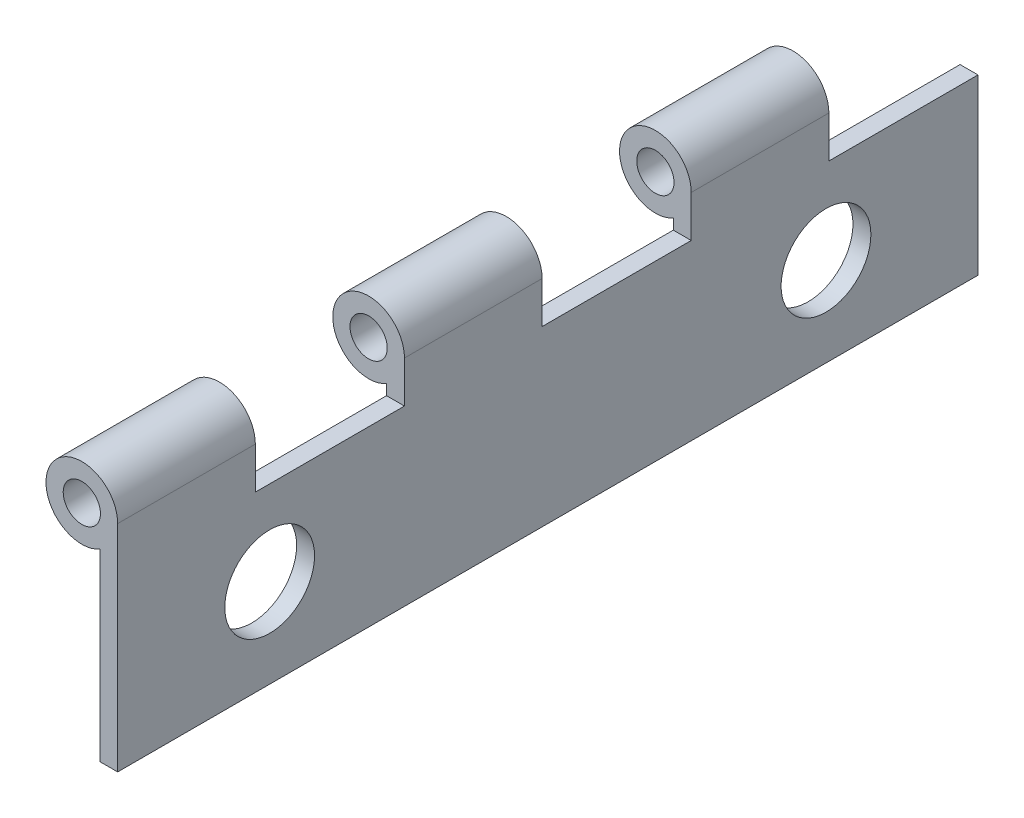
ISO-10303-21;
HEADER;
FILE_DESCRIPTION(('STEP AP214'),'2;1');
FILE_NAME('part.step','',(''),(''),'','','');
FILE_SCHEMA(('AUTOMOTIVE_DESIGN { 1 0 10303 214 1 1 1 1 }'));
ENDSEC;
DATA;
#1=APPLICATION_CONTEXT('core data for automotive mechanical design processes');
#2=APPLICATION_PROTOCOL_DEFINITION('international standard','automotive_design',2000,#1);
#3=PRODUCT_CONTEXT('',#1,'mechanical');
#4=PRODUCT('Part','Part','',(#3));
#5=PRODUCT_RELATED_PRODUCT_CATEGORY('part','',(#4));
#6=PRODUCT_DEFINITION_FORMATION('','',#4);
#7=PRODUCT_DEFINITION_CONTEXT('part definition',#1,'design');
#8=PRODUCT_DEFINITION('design','',#6,#7);
#9=PRODUCT_DEFINITION_SHAPE('','',#8);
#10=(LENGTH_UNIT() NAMED_UNIT(*) SI_UNIT(.MILLI.,.METRE.));
#11=(NAMED_UNIT(*) PLANE_ANGLE_UNIT() SI_UNIT($,.RADIAN.));
#12=(NAMED_UNIT(*) SI_UNIT($,.STERADIAN.) SOLID_ANGLE_UNIT());
#13=UNCERTAINTY_MEASURE_WITH_UNIT(LENGTH_MEASURE(1.E-05),#10,'distance_accuracy_value','');
#14=(GEOMETRIC_REPRESENTATION_CONTEXT(3) GLOBAL_UNCERTAINTY_ASSIGNED_CONTEXT((#13)) GLOBAL_UNIT_ASSIGNED_CONTEXT((#10,
#11,#12)) REPRESENTATION_CONTEXT('',''));
#15=CARTESIAN_POINT('',(0.,0.,0.));
#16=DIRECTION('',(0.,0.,1.));
#17=DIRECTION('',(1.,0.,0.));
#18=AXIS2_PLACEMENT_3D('',#15,#16,#17);
#19=CARTESIAN_POINT('',(-1.58750000000001,19.05,76.2));
#20=DIRECTION('',(0.,0.,-1.));
#21=DIRECTION('',(-1.,0.,0.));
#22=AXIS2_PLACEMENT_3D('',#19,#20,#21);
#23=CYLINDRICAL_SURFACE('',#22,1.651);
#24=CARTESIAN_POINT('',(-1.58750000000001,19.05,25.4));
#25=DIRECTION('',(0.,0.,-1.));
#26=DIRECTION('',(-1.,0.,0.));
#27=AXIS2_PLACEMENT_3D('',#24,#25,#26);
#28=CIRCLE('',#27,1.651);
#29=CARTESIAN_POINT('',(-3.23850000000001,19.05,25.4));
#30=VERTEX_POINT('',#29);
#31=EDGE_CURVE('E204',#30,#30,#28,.F.);
#32=ORIENTED_EDGE('',*,*,#31,.T.);
#33=EDGE_LOOP('',(#32));
#34=FACE_BOUND('',#33,.T.);
#35=CARTESIAN_POINT('',(-1.58750000000001,19.05,13.208));
#36=DIRECTION('',(0.,0.,-1.));
#37=DIRECTION('',(-1.,0.,0.));
#38=AXIS2_PLACEMENT_3D('',#35,#36,#37);
#39=CIRCLE('',#38,1.651);
#40=CARTESIAN_POINT('',(-3.23850000000001,19.05,13.208));
#41=VERTEX_POINT('',#40);
#42=EDGE_CURVE('E20',#41,#41,#39,.T.);
#43=ORIENTED_EDGE('',*,*,#42,.T.);
#44=EDGE_LOOP('',(#43));
#45=FACE_BOUND('',#44,.T.);
#46=ADVANCED_FACE('F17',(#34,#45),#23,.F.);
#47=CARTESIAN_POINT('',(-1.58750000000001,19.05,76.2));
#48=DIRECTION('',(0.,0.,-1.));
#49=DIRECTION('',(-1.,0.,0.));
#50=AXIS2_PLACEMENT_3D('',#47,#48,#49);
#51=CYLINDRICAL_SURFACE('',#50,1.651);
#52=CARTESIAN_POINT('',(-1.58750000000001,19.05,38.608));
#53=DIRECTION('',(0.,0.,-1.));
#54=DIRECTION('',(-1.,0.,0.));
#55=AXIS2_PLACEMENT_3D('',#52,#53,#54);
#56=CIRCLE('',#55,1.651);
#57=CARTESIAN_POINT('',(-3.23850000000001,19.05,38.608));
#58=VERTEX_POINT('',#57);
#59=EDGE_CURVE('E231',#58,#58,#56,.T.);
#60=ORIENTED_EDGE('',*,*,#59,.T.);
#61=EDGE_LOOP('',(#60));
#62=FACE_BOUND('',#61,.T.);
#63=CARTESIAN_POINT('',(-1.58750000000001,19.05,50.8));
#64=DIRECTION('',(0.,0.,-1.));
#65=DIRECTION('',(-1.,0.,0.));
#66=AXIS2_PLACEMENT_3D('',#63,#64,#65);
#67=CIRCLE('',#66,1.651);
#68=CARTESIAN_POINT('',(-3.23850000000001,19.05,50.8));
#69=VERTEX_POINT('',#68);
#70=EDGE_CURVE('E192',#69,#69,#67,.F.);
#71=ORIENTED_EDGE('',*,*,#70,.T.);
#72=EDGE_LOOP('',(#71));
#73=FACE_BOUND('',#72,.T.);
#74=ADVANCED_FACE('F369',(#62,#73),#51,.F.);
#75=CARTESIAN_POINT('',(-1.58750000000001,19.05,76.2));
#76=DIRECTION('',(0.,0.,-1.));
#77=DIRECTION('',(-1.,0.,0.));
#78=AXIS2_PLACEMENT_3D('',#75,#76,#77);
#79=CYLINDRICAL_SURFACE('',#78,1.651);
#80=CARTESIAN_POINT('',(-1.58750000000001,19.05,64.008));
#81=DIRECTION('',(0.,0.,-1.));
#82=DIRECTION('',(-1.,0.,0.));
#83=AXIS2_PLACEMENT_3D('',#80,#81,#82);
#84=CIRCLE('',#83,1.651);
#85=CARTESIAN_POINT('',(-3.23850000000001,19.05,64.008));
#86=VERTEX_POINT('',#85);
#87=EDGE_CURVE('E221',#86,#86,#84,.T.);
#88=ORIENTED_EDGE('',*,*,#87,.T.);
#89=EDGE_LOOP('',(#88));
#90=FACE_BOUND('',#89,.T.);
#91=CARTESIAN_POINT('',(-1.58750000000001,19.05,76.2));
#92=DIRECTION('',(0.,0.,-1.));
#93=DIRECTION('',(-1.,0.,0.));
#94=AXIS2_PLACEMENT_3D('',#91,#92,#93);
#95=CIRCLE('',#94,1.651);
#96=CARTESIAN_POINT('',(-3.23850000000001,19.05,76.2));
#97=VERTEX_POINT('',#96);
#98=EDGE_CURVE('E213',#97,#97,#95,.T.);
#99=ORIENTED_EDGE('',*,*,#98,.F.);
#100=EDGE_LOOP('',(#99));
#101=FACE_BOUND('',#100,.T.);
#102=ADVANCED_FACE('F360',(#90,#101),#79,.F.);
#103=CARTESIAN_POINT('',(0.,0.,0.));
#104=DIRECTION('',(-1.,0.,0.));
#105=DIRECTION('',(0.,-1.,0.));
#106=AXIS2_PLACEMENT_3D('',#103,#104,#105);
#107=PLANE('',#106);
#108=CARTESIAN_POINT('',(0.,7.874,13.462));
#109=DIRECTION('',(1.,0.,0.));
#110=DIRECTION('',(0.,0.,-1.));
#111=AXIS2_PLACEMENT_3D('',#108,#109,#110);
#112=CIRCLE('',#111,3.9751);
#113=CARTESIAN_POINT('',(0.,7.874,9.4869));
#114=VERTEX_POINT('',#113);
#115=EDGE_CURVE('E142',#114,#114,#112,.T.);
#116=ORIENTED_EDGE('',*,*,#115,.T.);
#117=EDGE_LOOP('',(#116));
#118=FACE_BOUND('',#117,.T.);
#119=CARTESIAN_POINT('',(0.,7.874,62.738));
#120=DIRECTION('',(1.,0.,0.));
#121=DIRECTION('',(0.,0.,-1.));
#122=AXIS2_PLACEMENT_3D('',#119,#120,#121);
#123=CIRCLE('',#122,3.9751);
#124=CARTESIAN_POINT('',(0.,7.874,58.7629));
#125=VERTEX_POINT('',#124);
#126=EDGE_CURVE('E145',#125,#125,#123,.T.);
#127=ORIENTED_EDGE('',*,*,#126,.T.);
#128=EDGE_LOOP('',(#127));
#129=FACE_BOUND('',#128,.T.);
#130=DIRECTION('',(0.,0.,1.));
#131=VECTOR('',#130,1.);
#132=CARTESIAN_POINT('',(0.,16.3003693429844,0.));
#133=LINE('',#132,#131);
#134=CARTESIAN_POINT('',(0.,16.3003693429844,13.208));
#135=VERTEX_POINT('',#134);
#136=CARTESIAN_POINT('',(0.,16.3003693429844,25.4));
#137=VERTEX_POINT('',#136);
#138=EDGE_CURVE('E127',#135,#137,#133,.T.);
#139=ORIENTED_EDGE('',*,*,#138,.F.);
#140=DIRECTION('',(0.,1.,0.));
#141=VECTOR('',#140,1.);
#142=CARTESIAN_POINT('',(0.,22.225,13.208));
#143=LINE('',#142,#141);
#144=CARTESIAN_POINT('',(0.,15.367,13.208));
#145=VERTEX_POINT('',#144);
#146=EDGE_CURVE('E123',#135,#145,#143,.F.);
#147=ORIENTED_EDGE('',*,*,#146,.T.);
#148=DIRECTION('',(0.,0.,1.));
#149=VECTOR('',#148,1.);
#150=CARTESIAN_POINT('',(0.,15.367,6.604));
#151=LINE('',#150,#149);
#152=CARTESIAN_POINT('',(0.,15.367,0.));
#153=VERTEX_POINT('',#152);
#154=EDGE_CURVE('E156',#153,#145,#151,.T.);
#155=ORIENTED_EDGE('',*,*,#154,.F.);
#156=DIRECTION('',(0.,1.,0.));
#157=VECTOR('',#156,1.);
#158=CARTESIAN_POINT('',(0.,11.825400192215,0.));
#159=LINE('',#158,#157);
#160=CARTESIAN_POINT('',(0.,0.,0.));
#161=VERTEX_POINT('',#160);
#162=EDGE_CURVE('E168',#153,#161,#159,.F.);
#163=ORIENTED_EDGE('',*,*,#162,.T.);
#164=DIRECTION('',(0.,0.,1.));
#165=VECTOR('',#164,1.);
#166=CARTESIAN_POINT('',(0.,0.,0.));
#167=LINE('',#166,#165);
#168=CARTESIAN_POINT('',(0.,0.,76.2));
#169=VERTEX_POINT('',#168);
#170=EDGE_CURVE('E170',#169,#161,#167,.F.);
#171=ORIENTED_EDGE('',*,*,#170,.F.);
#172=DIRECTION('',(0.,1.,0.));
#173=VECTOR('',#172,1.);
#174=CARTESIAN_POINT('',(0.,11.825400192215,76.2));
#175=LINE('',#174,#173);
#176=CARTESIAN_POINT('',(0.,16.3003693429844,76.2));
#177=VERTEX_POINT('',#176);
#178=EDGE_CURVE('E216',#177,#169,#175,.F.);
#179=ORIENTED_EDGE('',*,*,#178,.F.);
#180=DIRECTION('',(0.,0.,1.));
#181=VECTOR('',#180,1.);
#182=CARTESIAN_POINT('',(0.,16.3003693429844,0.));
#183=LINE('',#182,#181);
#184=CARTESIAN_POINT('',(0.,16.3003693429844,64.008));
#185=VERTEX_POINT('',#184);
#186=EDGE_CURVE('E184',#185,#177,#183,.T.);
#187=ORIENTED_EDGE('',*,*,#186,.F.);
#188=DIRECTION('',(0.,1.,0.));
#189=VECTOR('',#188,1.);
#190=CARTESIAN_POINT('',(0.,22.225,64.008));
#191=LINE('',#190,#189);
#192=CARTESIAN_POINT('',(0.,15.367,64.008));
#193=VERTEX_POINT('',#192);
#194=EDGE_CURVE('E282',#185,#193,#191,.F.);
#195=ORIENTED_EDGE('',*,*,#194,.T.);
#196=DIRECTION('',(0.,0.,1.));
#197=VECTOR('',#196,1.);
#198=CARTESIAN_POINT('',(0.,15.367,57.404));
#199=LINE('',#198,#197);
#200=CARTESIAN_POINT('',(0.,15.367,50.8));
#201=VERTEX_POINT('',#200);
#202=EDGE_CURVE('E188',#201,#193,#199,.T.);
#203=ORIENTED_EDGE('',*,*,#202,.F.);
#204=DIRECTION('',(0.,1.,0.));
#205=VECTOR('',#204,1.);
#206=CARTESIAN_POINT('',(0.,22.225,50.8));
#207=LINE('',#206,#205);
#208=CARTESIAN_POINT('',(0.,16.3003693429844,50.8));
#209=VERTEX_POINT('',#208);
#210=EDGE_CURVE('E198',#201,#209,#207,.T.);
#211=ORIENTED_EDGE('',*,*,#210,.T.);
#212=DIRECTION('',(0.,0.,1.));
#213=VECTOR('',#212,1.);
#214=CARTESIAN_POINT('',(0.,16.3003693429844,0.));
#215=LINE('',#214,#213);
#216=CARTESIAN_POINT('',(0.,16.3003693429844,38.608));
#217=VERTEX_POINT('',#216);
#218=EDGE_CURVE('E195',#217,#209,#215,.T.);
#219=ORIENTED_EDGE('',*,*,#218,.F.);
#220=DIRECTION('',(0.,1.,0.));
#221=VECTOR('',#220,1.);
#222=CARTESIAN_POINT('',(0.,22.225,38.608));
#223=LINE('',#222,#221);
#224=CARTESIAN_POINT('',(0.,15.367,38.608));
#225=VERTEX_POINT('',#224);
#226=EDGE_CURVE('E250',#217,#225,#223,.F.);
#227=ORIENTED_EDGE('',*,*,#226,.T.);
#228=DIRECTION('',(0.,0.,1.));
#229=VECTOR('',#228,1.);
#230=CARTESIAN_POINT('',(0.,15.367,32.004));
#231=LINE('',#230,#229);
#232=CARTESIAN_POINT('',(0.,15.367,25.4));
#233=VERTEX_POINT('',#232);
#234=EDGE_CURVE('E200',#233,#225,#231,.T.);
#235=ORIENTED_EDGE('',*,*,#234,.F.);
#236=DIRECTION('',(0.,1.,0.));
#237=VECTOR('',#236,1.);
#238=CARTESIAN_POINT('',(0.,22.225,25.4));
#239=LINE('',#238,#237);
#240=EDGE_CURVE('E207',#233,#137,#239,.T.);
#241=ORIENTED_EDGE('',*,*,#240,.T.);
#242=EDGE_LOOP('',(#139,#147,#155,#163,#171,#179,#187,#195,#203,#211,#219,#227,#235,#241));
#243=FACE_BOUND('',#242,.T.);
#244=ADVANCED_FACE('F325',(#118,#129,#243),#107,.T.);
#245=CARTESIAN_POINT('',(-4.7625,22.225,13.208));
#246=DIRECTION('',(0.,0.,1.));
#247=DIRECTION('',(1.,0.,0.));
#248=AXIS2_PLACEMENT_3D('',#245,#246,#247);
#249=PLANE('',#248);
#250=ORIENTED_EDGE('',*,*,#42,.F.);
#251=EDGE_LOOP('',(#250));
#252=FACE_BOUND('',#251,.T.);
#253=DIRECTION('',(0.,1.,0.));
#254=VECTOR('',#253,1.);
#255=CARTESIAN_POINT('',(1.58749999999999,19.05,13.208));
#256=LINE('',#255,#254);
#257=CARTESIAN_POINT('',(1.5875,15.367,13.208));
#258=VERTEX_POINT('',#257);
#259=CARTESIAN_POINT('',(1.58749999999999,19.05,13.208));
#260=VERTEX_POINT('',#259);
#261=EDGE_CURVE('E121',#258,#260,#256,.T.);
#262=ORIENTED_EDGE('',*,*,#261,.F.);
#263=DIRECTION('',(1.,0.,0.));
#264=VECTOR('',#263,1.);
#265=CARTESIAN_POINT('',(-1.58750000000001,15.367,13.208));
#266=LINE('',#265,#264);
#267=EDGE_CURVE('E154',#145,#258,#266,.T.);
#268=ORIENTED_EDGE('',*,*,#267,.F.);
#269=ORIENTED_EDGE('',*,*,#146,.F.);
#270=CARTESIAN_POINT('',(-1.58750000000001,19.05,13.208));
#271=DIRECTION('',(0.,0.,1.));
#272=DIRECTION('',(1.,0.,0.));
#273=AXIS2_PLACEMENT_3D('',#270,#271,#272);
#274=CIRCLE('',#273,3.175);
#275=EDGE_CURVE('E116',#260,#135,#274,.T.);
#276=ORIENTED_EDGE('',*,*,#275,.F.);
#277=EDGE_LOOP('',(#262,#268,#269,#276));
#278=FACE_BOUND('',#277,.T.);
#279=ADVANCED_FACE('F118',(#252,#278),#249,.F.);
#280=CARTESIAN_POINT('',(-1.58750000000001,19.05,0.));
#281=DIRECTION('',(0.,0.,1.));
#282=DIRECTION('',(1.,0.,0.));
#283=AXIS2_PLACEMENT_3D('',#280,#281,#282);
#284=CYLINDRICAL_SURFACE('',#283,3.175);
#285=CARTESIAN_POINT('',(-1.58750000000001,19.05,25.4));
#286=DIRECTION('',(0.,0.,1.));
#287=DIRECTION('',(1.,0.,0.));
#288=AXIS2_PLACEMENT_3D('',#285,#286,#287);
#289=CIRCLE('',#288,3.175);
#290=CARTESIAN_POINT('',(1.58749999999999,19.05,25.4));
#291=VERTEX_POINT('',#290);
#292=EDGE_CURVE('E132',#137,#291,#289,.F.);
#293=ORIENTED_EDGE('',*,*,#292,.T.);
#294=DIRECTION('',(0.,0.,1.));
#295=VECTOR('',#294,1.);
#296=CARTESIAN_POINT('',(1.58749999999999,19.05,0.));
#297=LINE('',#296,#295);
#298=EDGE_CURVE('E129',#260,#291,#297,.T.);
#299=ORIENTED_EDGE('',*,*,#298,.F.);
#300=ORIENTED_EDGE('',*,*,#275,.T.);
#301=ORIENTED_EDGE('',*,*,#138,.T.);
#302=EDGE_LOOP('',(#293,#299,#300,#301));
#303=FACE_BOUND('',#302,.T.);
#304=ADVANCED_FACE('F130',(#303),#284,.T.);
#305=CARTESIAN_POINT('',(1.5875,22.225,25.4));
#306=DIRECTION('',(0.,0.,-1.));
#307=DIRECTION('',(-1.,0.,0.));
#308=AXIS2_PLACEMENT_3D('',#305,#306,#307);
#309=PLANE('',#308);
#310=ORIENTED_EDGE('',*,*,#31,.F.);
#311=EDGE_LOOP('',(#310));
#312=FACE_BOUND('',#311,.T.);
#313=ORIENTED_EDGE('',*,*,#240,.F.);
#314=DIRECTION('',(1.,0.,0.));
#315=VECTOR('',#314,1.);
#316=CARTESIAN_POINT('',(-1.58750000000001,15.367,25.4));
#317=LINE('',#316,#315);
#318=CARTESIAN_POINT('',(1.5875,15.367,25.4));
#319=VERTEX_POINT('',#318);
#320=EDGE_CURVE('E203',#319,#233,#317,.F.);
#321=ORIENTED_EDGE('',*,*,#320,.F.);
#322=DIRECTION('',(0.,1.,0.));
#323=VECTOR('',#322,1.);
#324=CARTESIAN_POINT('',(1.58749999999999,19.05,25.4));
#325=LINE('',#324,#323);
#326=EDGE_CURVE('E136',#291,#319,#325,.F.);
#327=ORIENTED_EDGE('',*,*,#326,.F.);
#328=ORIENTED_EDGE('',*,*,#292,.F.);
#329=EDGE_LOOP('',(#313,#321,#327,#328));
#330=FACE_BOUND('',#329,.T.);
#331=ADVANCED_FACE('F407',(#312,#330),#309,.F.);
#332=CARTESIAN_POINT('',(-1.58750000000001,15.367,32.004));
#333=DIRECTION('',(0.,1.,0.));
#334=DIRECTION('',(0.,0.,1.));
#335=AXIS2_PLACEMENT_3D('',#332,#333,#334);
#336=PLANE('',#335);
#337=DIRECTION('',(0.,0.,1.));
#338=VECTOR('',#337,1.);
#339=CARTESIAN_POINT('',(1.5875,15.367,0.));
#340=LINE('',#339,#338);
#341=CARTESIAN_POINT('',(1.5875,15.367,38.608));
#342=VERTEX_POINT('',#341);
#343=EDGE_CURVE('E245',#319,#342,#340,.T.);
#344=ORIENTED_EDGE('',*,*,#343,.F.);
#345=ORIENTED_EDGE('',*,*,#320,.T.);
#346=ORIENTED_EDGE('',*,*,#234,.T.);
#347=DIRECTION('',(1.,0.,0.));
#348=VECTOR('',#347,1.);
#349=CARTESIAN_POINT('',(-4.7625,15.367,38.608));
#350=LINE('',#349,#348);
#351=EDGE_CURVE('E234',#225,#342,#350,.T.);
#352=ORIENTED_EDGE('',*,*,#351,.T.);
#353=EDGE_LOOP('',(#344,#345,#346,#352));
#354=FACE_BOUND('',#353,.T.);
#355=ADVANCED_FACE('F404',(#354),#336,.T.);
#356=CARTESIAN_POINT('',(-4.7625,22.225,38.608));
#357=DIRECTION('',(0.,0.,1.));
#358=DIRECTION('',(1.,0.,0.));
#359=AXIS2_PLACEMENT_3D('',#356,#357,#358);
#360=PLANE('',#359);
#361=ORIENTED_EDGE('',*,*,#59,.F.);
#362=EDGE_LOOP('',(#361));
#363=FACE_BOUND('',#362,.T.);
#364=DIRECTION('',(0.,1.,0.));
#365=VECTOR('',#364,1.);
#366=CARTESIAN_POINT('',(1.58749999999999,19.05,38.608));
#367=LINE('',#366,#365);
#368=CARTESIAN_POINT('',(1.58749999999999,19.05,38.608));
#369=VERTEX_POINT('',#368);
#370=EDGE_CURVE('E255',#342,#369,#367,.T.);
#371=ORIENTED_EDGE('',*,*,#370,.F.);
#372=ORIENTED_EDGE('',*,*,#351,.F.);
#373=ORIENTED_EDGE('',*,*,#226,.F.);
#374=CARTESIAN_POINT('',(-1.58750000000001,19.05,38.608));
#375=DIRECTION('',(0.,0.,1.));
#376=DIRECTION('',(1.,0.,0.));
#377=AXIS2_PLACEMENT_3D('',#374,#375,#376);
#378=CIRCLE('',#377,3.175);
#379=EDGE_CURVE('E199',#369,#217,#378,.T.);
#380=ORIENTED_EDGE('',*,*,#379,.F.);
#381=EDGE_LOOP('',(#371,#372,#373,#380));
#382=FACE_BOUND('',#381,.T.);
#383=ADVANCED_FACE('F405',(#363,#382),#360,.F.);
#384=CARTESIAN_POINT('',(-1.58750000000001,19.05,0.));
#385=DIRECTION('',(0.,0.,1.));
#386=DIRECTION('',(1.,0.,0.));
#387=AXIS2_PLACEMENT_3D('',#384,#385,#386);
#388=CYLINDRICAL_SURFACE('',#387,3.175);
#389=CARTESIAN_POINT('',(-1.58750000000001,19.05,50.8));
#390=DIRECTION('',(0.,0.,1.));
#391=DIRECTION('',(1.,0.,0.));
#392=AXIS2_PLACEMENT_3D('',#389,#390,#391);
#393=CIRCLE('',#392,3.175);
#394=CARTESIAN_POINT('',(1.58749999999999,19.05,50.8));
#395=VERTEX_POINT('',#394);
#396=EDGE_CURVE('E227',#209,#395,#393,.F.);
#397=ORIENTED_EDGE('',*,*,#396,.T.);
#398=DIRECTION('',(0.,0.,1.));
#399=VECTOR('',#398,1.);
#400=CARTESIAN_POINT('',(1.58749999999999,19.05,0.));
#401=LINE('',#400,#399);
#402=EDGE_CURVE('E266',#369,#395,#401,.T.);
#403=ORIENTED_EDGE('',*,*,#402,.F.);
#404=ORIENTED_EDGE('',*,*,#379,.T.);
#405=ORIENTED_EDGE('',*,*,#218,.T.);
#406=EDGE_LOOP('',(#397,#403,#404,#405));
#407=FACE_BOUND('',#406,.T.);
#408=ADVANCED_FACE('F387',(#407),#388,.T.);
#409=CARTESIAN_POINT('',(1.5875,22.225,50.8));
#410=DIRECTION('',(0.,0.,-1.));
#411=DIRECTION('',(-1.,0.,0.));
#412=AXIS2_PLACEMENT_3D('',#409,#410,#411);
#413=PLANE('',#412);
#414=ORIENTED_EDGE('',*,*,#70,.F.);
#415=EDGE_LOOP('',(#414));
#416=FACE_BOUND('',#415,.T.);
#417=ORIENTED_EDGE('',*,*,#210,.F.);
#418=DIRECTION('',(1.,0.,0.));
#419=VECTOR('',#418,1.);
#420=CARTESIAN_POINT('',(-1.58750000000001,15.367,50.8));
#421=LINE('',#420,#419);
#422=CARTESIAN_POINT('',(1.5875,15.367,50.8));
#423=VERTEX_POINT('',#422);
#424=EDGE_CURVE('E191',#423,#201,#421,.F.);
#425=ORIENTED_EDGE('',*,*,#424,.F.);
#426=DIRECTION('',(0.,1.,0.));
#427=VECTOR('',#426,1.);
#428=CARTESIAN_POINT('',(1.58749999999999,19.05,50.8));
#429=LINE('',#428,#427);
#430=EDGE_CURVE('E269',#395,#423,#429,.F.);
#431=ORIENTED_EDGE('',*,*,#430,.F.);
#432=ORIENTED_EDGE('',*,*,#396,.F.);
#433=EDGE_LOOP('',(#417,#425,#431,#432));
#434=FACE_BOUND('',#433,.T.);
#435=ADVANCED_FACE('F383',(#416,#434),#413,.F.);
#436=CARTESIAN_POINT('',(-1.58750000000001,15.367,57.404));
#437=DIRECTION('',(0.,1.,0.));
#438=DIRECTION('',(0.,0.,1.));
#439=AXIS2_PLACEMENT_3D('',#436,#437,#438);
#440=PLANE('',#439);
#441=DIRECTION('',(0.,0.,1.));
#442=VECTOR('',#441,1.);
#443=CARTESIAN_POINT('',(1.5875,15.367,0.));
#444=LINE('',#443,#442);
#445=CARTESIAN_POINT('',(1.5875,15.367,64.008));
#446=VERTEX_POINT('',#445);
#447=EDGE_CURVE('E277',#423,#446,#444,.T.);
#448=ORIENTED_EDGE('',*,*,#447,.F.);
#449=ORIENTED_EDGE('',*,*,#424,.T.);
#450=ORIENTED_EDGE('',*,*,#202,.T.);
#451=DIRECTION('',(1.,0.,0.));
#452=VECTOR('',#451,1.);
#453=CARTESIAN_POINT('',(-4.7625,15.367,64.008));
#454=LINE('',#453,#452);
#455=EDGE_CURVE('E224',#193,#446,#454,.T.);
#456=ORIENTED_EDGE('',*,*,#455,.T.);
#457=EDGE_LOOP('',(#448,#449,#450,#456));
#458=FACE_BOUND('',#457,.T.);
#459=ADVANCED_FACE('F386',(#458),#440,.T.);
#460=CARTESIAN_POINT('',(-4.7625,22.225,64.008));
#461=DIRECTION('',(0.,0.,1.));
#462=DIRECTION('',(1.,0.,0.));
#463=AXIS2_PLACEMENT_3D('',#460,#461,#462);
#464=PLANE('',#463);
#465=ORIENTED_EDGE('',*,*,#87,.F.);
#466=EDGE_LOOP('',(#465));
#467=FACE_BOUND('',#466,.T.);
#468=DIRECTION('',(0.,1.,0.));
#469=VECTOR('',#468,1.);
#470=CARTESIAN_POINT('',(1.58749999999999,19.05,64.008));
#471=LINE('',#470,#469);
#472=CARTESIAN_POINT('',(1.58749999999999,19.05,64.008));
#473=VERTEX_POINT('',#472);
#474=EDGE_CURVE('E287',#446,#473,#471,.T.);
#475=ORIENTED_EDGE('',*,*,#474,.F.);
#476=ORIENTED_EDGE('',*,*,#455,.F.);
#477=ORIENTED_EDGE('',*,*,#194,.F.);
#478=CARTESIAN_POINT('',(-1.58750000000001,19.05,64.008));
#479=DIRECTION('',(0.,0.,1.));
#480=DIRECTION('',(1.,0.,0.));
#481=AXIS2_PLACEMENT_3D('',#478,#479,#480);
#482=CIRCLE('',#481,3.175);
#483=EDGE_CURVE('E187',#473,#185,#482,.T.);
#484=ORIENTED_EDGE('',*,*,#483,.F.);
#485=EDGE_LOOP('',(#475,#476,#477,#484));
#486=FACE_BOUND('',#485,.T.);
#487=ADVANCED_FACE('F425',(#467,#486),#464,.F.);
#488=CARTESIAN_POINT('',(-1.58750000000001,19.05,0.));
#489=DIRECTION('',(0.,0.,1.));
#490=DIRECTION('',(1.,0.,0.));
#491=AXIS2_PLACEMENT_3D('',#488,#489,#490);
#492=CYLINDRICAL_SURFACE('',#491,3.175);
#493=CARTESIAN_POINT('',(-1.58750000000001,19.05,76.2));
#494=DIRECTION('',(0.,0.,1.));
#495=DIRECTION('',(1.,0.,0.));
#496=AXIS2_PLACEMENT_3D('',#493,#494,#495);
#497=CIRCLE('',#496,3.175);
#498=CARTESIAN_POINT('',(1.58749999999999,19.05,76.2));
#499=VERTEX_POINT('',#498);
#500=EDGE_CURVE('E186',#499,#177,#497,.T.);
#501=ORIENTED_EDGE('',*,*,#500,.F.);
#502=DIRECTION('',(0.,0.,1.));
#503=VECTOR('',#502,1.);
#504=CARTESIAN_POINT('',(1.58749999999999,19.05,0.));
#505=LINE('',#504,#503);
#506=EDGE_CURVE('E298',#473,#499,#505,.T.);
#507=ORIENTED_EDGE('',*,*,#506,.F.);
#508=ORIENTED_EDGE('',*,*,#483,.T.);
#509=ORIENTED_EDGE('',*,*,#186,.T.);
#510=EDGE_LOOP('',(#501,#507,#508,#509));
#511=FACE_BOUND('',#510,.T.);
#512=ADVANCED_FACE('F428',(#511),#492,.T.);
#513=CARTESIAN_POINT('',(0.0178378172368279,11.825400192215,76.2));
#514=DIRECTION('',(0.,0.,1.));
#515=DIRECTION('',(1.,0.,0.));
#516=AXIS2_PLACEMENT_3D('',#513,#514,#515);
#517=PLANE('',#516);
#518=ORIENTED_EDGE('',*,*,#98,.T.);
#519=EDGE_LOOP('',(#518));
#520=FACE_BOUND('',#519,.T.);
#521=DIRECTION('',(1.,0.,0.));
#522=VECTOR('',#521,1.);
#523=CARTESIAN_POINT('',(1.5875,0.,76.2));
#524=LINE('',#523,#522);
#525=CARTESIAN_POINT('',(1.5875,0.,76.2));
#526=VERTEX_POINT('',#525);
#527=EDGE_CURVE('E178',#526,#169,#524,.F.);
#528=ORIENTED_EDGE('',*,*,#527,.F.);
#529=DIRECTION('',(0.,1.,0.));
#530=VECTOR('',#529,1.);
#531=CARTESIAN_POINT('',(1.58749999999999,19.05,76.2));
#532=LINE('',#531,#530);
#533=EDGE_CURVE('E308',#499,#526,#532,.F.);
#534=ORIENTED_EDGE('',*,*,#533,.F.);
#535=ORIENTED_EDGE('',*,*,#500,.T.);
#536=ORIENTED_EDGE('',*,*,#178,.T.);
#537=EDGE_LOOP('',(#528,#534,#535,#536));
#538=FACE_BOUND('',#537,.T.);
#539=ADVANCED_FACE('F432',(#520,#538),#517,.T.);
#540=CARTESIAN_POINT('',(1.5875,0.,0.));
#541=DIRECTION('',(0.,-1.,0.));
#542=DIRECTION('',(1.,0.,0.));
#543=AXIS2_PLACEMENT_3D('',#540,#541,#542);
#544=PLANE('',#543);
#545=DIRECTION('',(1.,0.,0.));
#546=VECTOR('',#545,1.);
#547=CARTESIAN_POINT('',(0.0178378172368279,0.,0.));
#548=LINE('',#547,#546);
#549=CARTESIAN_POINT('',(1.5875,0.,0.));
#550=VERTEX_POINT('',#549);
#551=EDGE_CURVE('E165',#161,#550,#548,.T.);
#552=ORIENTED_EDGE('',*,*,#551,.T.);
#553=DIRECTION('',(0.,0.,1.));
#554=VECTOR('',#553,1.);
#555=CARTESIAN_POINT('',(1.5875,0.,0.));
#556=LINE('',#555,#554);
#557=EDGE_CURVE('E305',#526,#550,#556,.F.);
#558=ORIENTED_EDGE('',*,*,#557,.F.);
#559=ORIENTED_EDGE('',*,*,#527,.T.);
#560=ORIENTED_EDGE('',*,*,#170,.T.);
#561=EDGE_LOOP('',(#552,#558,#559,#560));
#562=FACE_BOUND('',#561,.T.);
#563=ADVANCED_FACE('F322',(#562),#544,.T.);
#564=CARTESIAN_POINT('',(0.0178378172368279,11.825400192215,0.));
#565=DIRECTION('',(0.,0.,1.));
#566=DIRECTION('',(1.,0.,0.));
#567=AXIS2_PLACEMENT_3D('',#564,#565,#566);
#568=PLANE('',#567);
#569=DIRECTION('',(0.,1.,0.));
#570=VECTOR('',#569,1.);
#571=CARTESIAN_POINT('',(1.58749999999999,19.05,0.));
#572=LINE('',#571,#570);
#573=CARTESIAN_POINT('',(1.5875,15.367,0.));
#574=VERTEX_POINT('',#573);
#575=EDGE_CURVE('E160',#550,#574,#572,.T.);
#576=ORIENTED_EDGE('',*,*,#575,.F.);
#577=ORIENTED_EDGE('',*,*,#551,.F.);
#578=ORIENTED_EDGE('',*,*,#162,.F.);
#579=DIRECTION('',(1.,0.,0.));
#580=VECTOR('',#579,1.);
#581=CARTESIAN_POINT('',(-1.58750000000001,15.367,0.));
#582=LINE('',#581,#580);
#583=EDGE_CURVE('E35',#574,#153,#582,.F.);
#584=ORIENTED_EDGE('',*,*,#583,.F.);
#585=EDGE_LOOP('',(#576,#577,#578,#584));
#586=FACE_BOUND('',#585,.T.);
#587=ADVANCED_FACE('F320',(#586),#568,.F.);
#588=CARTESIAN_POINT('',(-1.58750000000001,15.367,6.604));
#589=DIRECTION('',(0.,1.,0.));
#590=DIRECTION('',(0.,0.,1.));
#591=AXIS2_PLACEMENT_3D('',#588,#589,#590);
#592=PLANE('',#591);
#593=DIRECTION('',(0.,0.,1.));
#594=VECTOR('',#593,1.);
#595=CARTESIAN_POINT('',(1.5875,15.367,0.));
#596=LINE('',#595,#594);
#597=EDGE_CURVE('E141',#574,#258,#596,.T.);
#598=ORIENTED_EDGE('',*,*,#597,.F.);
#599=ORIENTED_EDGE('',*,*,#583,.T.);
#600=ORIENTED_EDGE('',*,*,#154,.T.);
#601=ORIENTED_EDGE('',*,*,#267,.T.);
#602=EDGE_LOOP('',(#598,#599,#600,#601));
#603=FACE_BOUND('',#602,.T.);
#604=ADVANCED_FACE('F328',(#603),#592,.T.);
#605=CARTESIAN_POINT('',(0.,7.874,62.738));
#606=DIRECTION('',(1.,0.,0.));
#607=DIRECTION('',(0.,0.,-1.));
#608=AXIS2_PLACEMENT_3D('',#605,#606,#607);
#609=CYLINDRICAL_SURFACE('',#608,3.9751);
#610=ORIENTED_EDGE('',*,*,#126,.F.);
#611=EDGE_LOOP('',(#610));
#612=FACE_BOUND('',#611,.T.);
#613=CARTESIAN_POINT('',(1.58749999999999,7.874,62.738));
#614=DIRECTION('',(1.,0.,0.));
#615=DIRECTION('',(0.,0.,-1.));
#616=AXIS2_PLACEMENT_3D('',#613,#614,#615);
#617=CIRCLE('',#616,3.9751);
#618=CARTESIAN_POINT('',(1.58749999999999,7.874,58.7629));
#619=VERTEX_POINT('',#618);
#620=EDGE_CURVE('E26',#619,#619,#617,.F.);
#621=ORIENTED_EDGE('',*,*,#620,.F.);
#622=EDGE_LOOP('',(#621));
#623=FACE_BOUND('',#622,.T.);
#624=ADVANCED_FACE('F330',(#612,#623),#609,.F.);
#625=CARTESIAN_POINT('',(0.,7.874,13.462));
#626=DIRECTION('',(1.,0.,0.));
#627=DIRECTION('',(0.,0.,-1.));
#628=AXIS2_PLACEMENT_3D('',#625,#626,#627);
#629=CYLINDRICAL_SURFACE('',#628,3.9751);
#630=ORIENTED_EDGE('',*,*,#115,.F.);
#631=EDGE_LOOP('',(#630));
#632=FACE_BOUND('',#631,.T.);
#633=CARTESIAN_POINT('',(1.58749999999999,7.874,13.462));
#634=DIRECTION('',(1.,0.,0.));
#635=DIRECTION('',(0.,0.,-1.));
#636=AXIS2_PLACEMENT_3D('',#633,#634,#635);
#637=CIRCLE('',#636,3.9751);
#638=CARTESIAN_POINT('',(1.58749999999999,7.874,9.4869));
#639=VERTEX_POINT('',#638);
#640=EDGE_CURVE('E11',#639,#639,#637,.F.);
#641=ORIENTED_EDGE('',*,*,#640,.F.);
#642=EDGE_LOOP('',(#641));
#643=FACE_BOUND('',#642,.T.);
#644=ADVANCED_FACE('F337',(#632,#643),#629,.F.);
#645=CARTESIAN_POINT('',(1.58749999999999,19.05,0.));
#646=DIRECTION('',(1.,0.,0.));
#647=DIRECTION('',(0.,1.,0.));
#648=AXIS2_PLACEMENT_3D('',#645,#646,#647);
#649=PLANE('',#648);
#650=ORIENTED_EDGE('',*,*,#640,.T.);
#651=EDGE_LOOP('',(#650));
#652=FACE_BOUND('',#651,.T.);
#653=ORIENTED_EDGE('',*,*,#620,.T.);
#654=EDGE_LOOP('',(#653));
#655=FACE_BOUND('',#654,.T.);
#656=ORIENTED_EDGE('',*,*,#575,.T.);
#657=ORIENTED_EDGE('',*,*,#597,.T.);
#658=ORIENTED_EDGE('',*,*,#261,.T.);
#659=ORIENTED_EDGE('',*,*,#298,.T.);
#660=ORIENTED_EDGE('',*,*,#326,.T.);
#661=ORIENTED_EDGE('',*,*,#343,.T.);
#662=ORIENTED_EDGE('',*,*,#370,.T.);
#663=ORIENTED_EDGE('',*,*,#402,.T.);
#664=ORIENTED_EDGE('',*,*,#430,.T.);
#665=ORIENTED_EDGE('',*,*,#447,.T.);
#666=ORIENTED_EDGE('',*,*,#474,.T.);
#667=ORIENTED_EDGE('',*,*,#506,.T.);
#668=ORIENTED_EDGE('',*,*,#533,.T.);
#669=ORIENTED_EDGE('',*,*,#557,.T.);
#670=EDGE_LOOP('',(#656,#657,#658,#659,#660,#661,#662,#663,#664,#665,#666,#667,#668,#669));
#671=FACE_BOUND('',#670,.T.);
#672=ADVANCED_FACE('F140',(#652,#655,#671),#649,.T.);
#673=CLOSED_SHELL('',(#46,#74,#102,#244,#279,#304,#331,#355,#383,#408,#435,#459,#487,#512,#539,
#563,#587,#604,#624,#644,#672));
#674=MANIFOLD_SOLID_BREP('B1',#673);
#675=ADVANCED_BREP_SHAPE_REPRESENTATION('',(#18,#674),#14);
#676=SHAPE_DEFINITION_REPRESENTATION(#9,#675);
ENDSEC;
END-ISO-10303-21;
